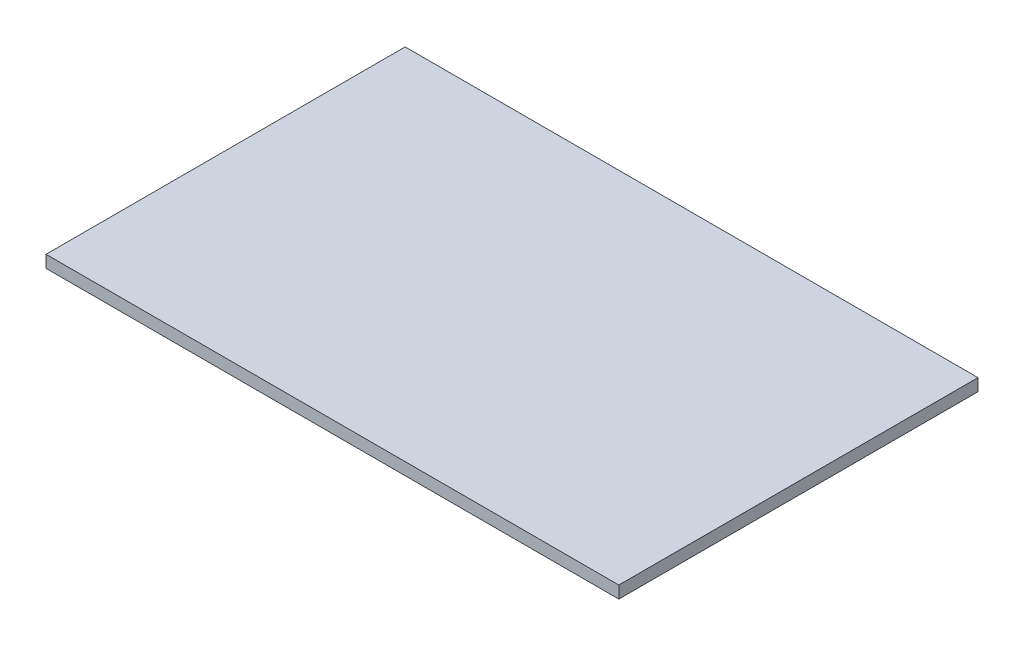
ISO-10303-21;
HEADER;
FILE_DESCRIPTION(('STEP AP214'),'2;1');
FILE_NAME('part.step','',(''),(''),'','','');
FILE_SCHEMA(('AUTOMOTIVE_DESIGN { 1 0 10303 214 1 1 1 1 }'));
ENDSEC;
DATA;
#1=APPLICATION_CONTEXT('core data for automotive mechanical design processes');
#2=APPLICATION_PROTOCOL_DEFINITION('international standard','automotive_design',2000,#1);
#3=PRODUCT_CONTEXT('',#1,'mechanical');
#4=PRODUCT('Part','Part','',(#3));
#5=PRODUCT_RELATED_PRODUCT_CATEGORY('part','',(#4));
#6=PRODUCT_DEFINITION_FORMATION('','',#4);
#7=PRODUCT_DEFINITION_CONTEXT('part definition',#1,'design');
#8=PRODUCT_DEFINITION('design','',#6,#7);
#9=PRODUCT_DEFINITION_SHAPE('','',#8);
#10=(LENGTH_UNIT() NAMED_UNIT(*) SI_UNIT(.MILLI.,.METRE.));
#11=(NAMED_UNIT(*) PLANE_ANGLE_UNIT() SI_UNIT($,.RADIAN.));
#12=(NAMED_UNIT(*) SI_UNIT($,.STERADIAN.) SOLID_ANGLE_UNIT());
#13=UNCERTAINTY_MEASURE_WITH_UNIT(LENGTH_MEASURE(1.E-05),#10,'distance_accuracy_value','');
#14=(GEOMETRIC_REPRESENTATION_CONTEXT(3) GLOBAL_UNCERTAINTY_ASSIGNED_CONTEXT((#13)) GLOBAL_UNIT_ASSIGNED_CONTEXT((#10,
#11,#12)) REPRESENTATION_CONTEXT('',''));
#15=CARTESIAN_POINT('',(0.,0.,0.));
#16=DIRECTION('',(0.,0.,1.));
#17=DIRECTION('',(1.,0.,0.));
#18=AXIS2_PLACEMENT_3D('',#15,#16,#17);
#19=CARTESIAN_POINT('',(0.,1.2,0.));
#20=DIRECTION('',(-1.,0.,0.));
#21=DIRECTION('',(0.,0.,1.));
#22=AXIS2_PLACEMENT_3D('',#19,#20,#21);
#23=PLANE('',#22);
#24=DIRECTION('',(0.,0.,-1.));
#25=VECTOR('',#24,1.);
#26=CARTESIAN_POINT('',(0.,0.,0.));
#27=LINE('',#26,#25);
#28=CARTESIAN_POINT('',(0.,0.,0.));
#29=VERTEX_POINT('',#28);
#30=CARTESIAN_POINT('',(0.,0.,-35.3));
#31=VERTEX_POINT('',#30);
#32=EDGE_CURVE('E98',#29,#31,#27,.T.);
#33=ORIENTED_EDGE('',*,*,#32,.T.);
#34=DIRECTION('',(0.,-1.,0.));
#35=VECTOR('',#34,1.);
#36=CARTESIAN_POINT('',(0.,1.2,-35.3));
#37=LINE('',#36,#35);
#38=CARTESIAN_POINT('',(0.,1.2,-35.3));
#39=VERTEX_POINT('',#38);
#40=EDGE_CURVE('E11',#39,#31,#37,.T.);
#41=ORIENTED_EDGE('',*,*,#40,.F.);
#42=DIRECTION('',(0.,0.,-1.));
#43=VECTOR('',#42,1.);
#44=CARTESIAN_POINT('',(0.,1.2,0.));
#45=LINE('',#44,#43);
#46=CARTESIAN_POINT('',(0.,1.2,0.));
#47=VERTEX_POINT('',#46);
#48=EDGE_CURVE('E86',#47,#39,#45,.T.);
#49=ORIENTED_EDGE('',*,*,#48,.F.);
#50=DIRECTION('',(0.,-1.,0.));
#51=VECTOR('',#50,1.);
#52=CARTESIAN_POINT('',(0.,1.2,0.));
#53=LINE('',#52,#51);
#54=EDGE_CURVE('E94',#47,#29,#53,.T.);
#55=ORIENTED_EDGE('',*,*,#54,.T.);
#56=EDGE_LOOP('',(#33,#41,#49,#55));
#57=FACE_BOUND('',#56,.T.);
#58=ADVANCED_FACE('F35',(#57),#23,.F.);
#59=CARTESIAN_POINT('',(0.,1.2,-35.3));
#60=DIRECTION('',(0.,0.,1.));
#61=DIRECTION('',(1.,0.,0.));
#62=AXIS2_PLACEMENT_3D('',#59,#60,#61);
#63=PLANE('',#62);
#64=DIRECTION('',(-1.,0.,0.));
#65=VECTOR('',#64,1.);
#66=CARTESIAN_POINT('',(0.,0.,-35.3));
#67=LINE('',#66,#65);
#68=CARTESIAN_POINT('',(-56.3,0.,-35.3));
#69=VERTEX_POINT('',#68);
#70=EDGE_CURVE('E90',#31,#69,#67,.T.);
#71=ORIENTED_EDGE('',*,*,#70,.T.);
#72=DIRECTION('',(0.,-1.,0.));
#73=VECTOR('',#72,1.);
#74=CARTESIAN_POINT('',(-56.3,1.2,-35.3));
#75=LINE('',#74,#73);
#76=CARTESIAN_POINT('',(-56.3,1.2,-35.3));
#77=VERTEX_POINT('',#76);
#78=EDGE_CURVE('E43',#77,#69,#75,.T.);
#79=ORIENTED_EDGE('',*,*,#78,.F.);
#80=DIRECTION('',(-1.,0.,0.));
#81=VECTOR('',#80,1.);
#82=CARTESIAN_POINT('',(0.,1.2,-35.3));
#83=LINE('',#82,#81);
#84=EDGE_CURVE('E81',#39,#77,#83,.T.);
#85=ORIENTED_EDGE('',*,*,#84,.F.);
#86=ORIENTED_EDGE('',*,*,#40,.T.);
#87=EDGE_LOOP('',(#71,#79,#85,#86));
#88=FACE_BOUND('',#87,.T.);
#89=ADVANCED_FACE('F89',(#88),#63,.F.);
#90=CARTESIAN_POINT('',(-56.3,1.2,0.));
#91=DIRECTION('',(1.,0.,0.));
#92=DIRECTION('',(0.,0.,-1.));
#93=AXIS2_PLACEMENT_3D('',#90,#91,#92);
#94=PLANE('',#93);
#95=DIRECTION('',(0.,0.,1.));
#96=VECTOR('',#95,1.);
#97=CARTESIAN_POINT('',(-56.3,0.,0.));
#98=LINE('',#97,#96);
#99=CARTESIAN_POINT('',(-56.3,0.,0.));
#100=VERTEX_POINT('',#99);
#101=EDGE_CURVE('E68',#69,#100,#98,.T.);
#102=ORIENTED_EDGE('',*,*,#101,.T.);
#103=DIRECTION('',(0.,-1.,0.));
#104=VECTOR('',#103,1.);
#105=CARTESIAN_POINT('',(-56.3,1.2,0.));
#106=LINE('',#105,#104);
#107=CARTESIAN_POINT('',(-56.3,1.2,0.));
#108=VERTEX_POINT('',#107);
#109=EDGE_CURVE('E91',#108,#100,#106,.T.);
#110=ORIENTED_EDGE('',*,*,#109,.F.);
#111=DIRECTION('',(0.,0.,1.));
#112=VECTOR('',#111,1.);
#113=CARTESIAN_POINT('',(-56.3,1.2,0.));
#114=LINE('',#113,#112);
#115=EDGE_CURVE('E84',#77,#108,#114,.T.);
#116=ORIENTED_EDGE('',*,*,#115,.F.);
#117=ORIENTED_EDGE('',*,*,#78,.T.);
#118=EDGE_LOOP('',(#102,#110,#116,#117));
#119=FACE_BOUND('',#118,.T.);
#120=ADVANCED_FACE('F92',(#119),#94,.F.);
#121=CARTESIAN_POINT('',(0.,1.2,0.));
#122=DIRECTION('',(0.,0.,-1.));
#123=DIRECTION('',(-1.,0.,0.));
#124=AXIS2_PLACEMENT_3D('',#121,#122,#123);
#125=PLANE('',#124);
#126=DIRECTION('',(1.,0.,0.));
#127=VECTOR('',#126,1.);
#128=CARTESIAN_POINT('',(0.,0.,0.));
#129=LINE('',#128,#127);
#130=EDGE_CURVE('E74',#100,#29,#129,.T.);
#131=ORIENTED_EDGE('',*,*,#130,.T.);
#132=ORIENTED_EDGE('',*,*,#54,.F.);
#133=DIRECTION('',(1.,0.,0.));
#134=VECTOR('',#133,1.);
#135=CARTESIAN_POINT('',(0.,1.2,0.));
#136=LINE('',#135,#134);
#137=EDGE_CURVE('E51',#108,#47,#136,.T.);
#138=ORIENTED_EDGE('',*,*,#137,.F.);
#139=ORIENTED_EDGE('',*,*,#109,.T.);
#140=EDGE_LOOP('',(#131,#132,#138,#139));
#141=FACE_BOUND('',#140,.T.);
#142=ADVANCED_FACE('F105',(#141),#125,.F.);
#143=CARTESIAN_POINT('',(0.,1.2,0.));
#144=DIRECTION('',(0.,1.,0.));
#145=DIRECTION('',(0.,0.,1.));
#146=AXIS2_PLACEMENT_3D('',#143,#144,#145);
#147=PLANE('',#146);
#148=ORIENTED_EDGE('',*,*,#48,.T.);
#149=ORIENTED_EDGE('',*,*,#84,.T.);
#150=ORIENTED_EDGE('',*,*,#115,.T.);
#151=ORIENTED_EDGE('',*,*,#137,.T.);
#152=EDGE_LOOP('',(#148,#149,#150,#151));
#153=FACE_BOUND('',#152,.T.);
#154=ADVANCED_FACE('F82',(#153),#147,.T.);
#155=CARTESIAN_POINT('',(0.,0.,0.));
#156=DIRECTION('',(0.,1.,0.));
#157=DIRECTION('',(0.,0.,1.));
#158=AXIS2_PLACEMENT_3D('',#155,#156,#157);
#159=PLANE('',#158);
#160=ORIENTED_EDGE('',*,*,#32,.F.);
#161=ORIENTED_EDGE('',*,*,#130,.F.);
#162=ORIENTED_EDGE('',*,*,#101,.F.);
#163=ORIENTED_EDGE('',*,*,#70,.F.);
#164=EDGE_LOOP('',(#160,#161,#162,#163));
#165=FACE_BOUND('',#164,.T.);
#166=ADVANCED_FACE('F108',(#165),#159,.F.);
#167=CLOSED_SHELL('',(#58,#89,#120,#142,#154,#166));
#168=MANIFOLD_SOLID_BREP('B2',#167);
#169=ADVANCED_BREP_SHAPE_REPRESENTATION('',(#18,#168),#14);
#170=SHAPE_DEFINITION_REPRESENTATION(#9,#169);
ENDSEC;
END-ISO-10303-21;
